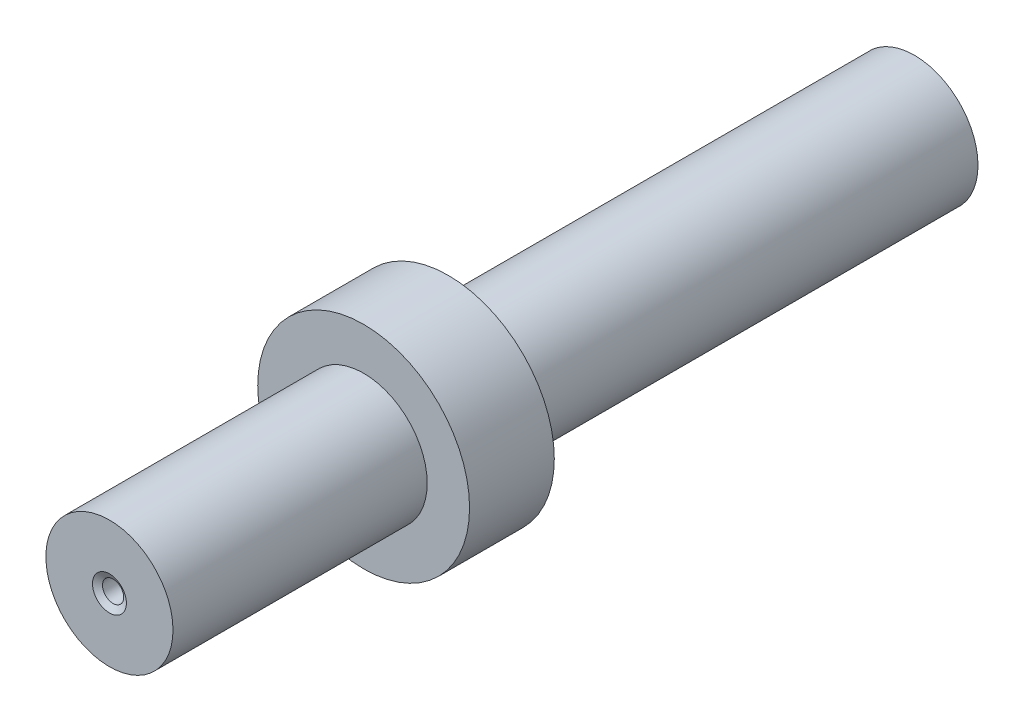
ISO-10303-21;
HEADER;
FILE_DESCRIPTION(('STEP AP214'),'2;1');
FILE_NAME('part.step','',(''),(''),'','','');
FILE_SCHEMA(('AUTOMOTIVE_DESIGN { 1 0 10303 214 1 1 1 1 }'));
ENDSEC;
DATA;
#1=APPLICATION_CONTEXT('core data for automotive mechanical design processes');
#2=APPLICATION_PROTOCOL_DEFINITION('international standard','automotive_design',2000,#1);
#3=PRODUCT_CONTEXT('',#1,'mechanical');
#4=PRODUCT('Part','Part','',(#3));
#5=PRODUCT_RELATED_PRODUCT_CATEGORY('part','',(#4));
#6=PRODUCT_DEFINITION_FORMATION('','',#4);
#7=PRODUCT_DEFINITION_CONTEXT('part definition',#1,'design');
#8=PRODUCT_DEFINITION('design','',#6,#7);
#9=PRODUCT_DEFINITION_SHAPE('','',#8);
#10=(LENGTH_UNIT() NAMED_UNIT(*) SI_UNIT(.MILLI.,.METRE.));
#11=(NAMED_UNIT(*) PLANE_ANGLE_UNIT() SI_UNIT($,.RADIAN.));
#12=(NAMED_UNIT(*) SI_UNIT($,.STERADIAN.) SOLID_ANGLE_UNIT());
#13=UNCERTAINTY_MEASURE_WITH_UNIT(LENGTH_MEASURE(1.E-05),#10,'distance_accuracy_value','');
#14=(GEOMETRIC_REPRESENTATION_CONTEXT(3) GLOBAL_UNCERTAINTY_ASSIGNED_CONTEXT((#13)) GLOBAL_UNIT_ASSIGNED_CONTEXT((#10,
#11,#12)) REPRESENTATION_CONTEXT('',''));
#15=CARTESIAN_POINT('',(0.,0.,0.));
#16=DIRECTION('',(0.,0.,1.));
#17=DIRECTION('',(1.,0.,0.));
#18=AXIS2_PLACEMENT_3D('',#15,#16,#17);
#19=CARTESIAN_POINT('',(0.,0.,10.));
#20=DIRECTION('',(0.,0.,-1.));
#21=DIRECTION('',(-1.,0.,0.));
#22=AXIS2_PLACEMENT_3D('',#19,#20,#21);
#23=CYLINDRICAL_SURFACE('',#22,12.5);
#24=CARTESIAN_POINT('',(0.,0.,10.));
#25=DIRECTION('',(0.,0.,1.));
#26=DIRECTION('',(1.,0.,0.));
#27=AXIS2_PLACEMENT_3D('',#24,#25,#26);
#28=CIRCLE('',#27,12.5);
#29=CARTESIAN_POINT('',(12.5,0.,10.));
#30=VERTEX_POINT('',#29);
#31=EDGE_CURVE('E54',#30,#30,#28,.T.);
#32=ORIENTED_EDGE('',*,*,#31,.F.);
#33=EDGE_LOOP('',(#32));
#34=FACE_BOUND('',#33,.T.);
#35=CARTESIAN_POINT('',(0.,0.,0.));
#36=DIRECTION('',(0.,0.,1.));
#37=DIRECTION('',(1.,0.,0.));
#38=AXIS2_PLACEMENT_3D('',#35,#36,#37);
#39=CIRCLE('',#38,12.5);
#40=CARTESIAN_POINT('',(12.5,0.,0.));
#41=VERTEX_POINT('',#40);
#42=EDGE_CURVE('E86',#41,#41,#39,.T.);
#43=ORIENTED_EDGE('',*,*,#42,.T.);
#44=EDGE_LOOP('',(#43));
#45=FACE_BOUND('',#44,.T.);
#46=ADVANCED_FACE('F47',(#34,#45),#23,.T.);
#47=CARTESIAN_POINT('',(0.,0.,10.));
#48=DIRECTION('',(0.,0.,1.));
#49=DIRECTION('',(1.,0.,0.));
#50=AXIS2_PLACEMENT_3D('',#47,#48,#49);
#51=PLANE('',#50);
#52=CARTESIAN_POINT('',(0.,0.,10.));
#53=DIRECTION('',(0.,0.,1.));
#54=DIRECTION('',(1.,0.,0.));
#55=AXIS2_PLACEMENT_3D('',#52,#53,#54);
#56=CIRCLE('',#55,7.5);
#57=CARTESIAN_POINT('',(7.5,0.,10.));
#58=VERTEX_POINT('',#57);
#59=EDGE_CURVE('E82',#58,#58,#56,.F.);
#60=ORIENTED_EDGE('',*,*,#59,.T.);
#61=EDGE_LOOP('',(#60));
#62=FACE_BOUND('',#61,.T.);
#63=ORIENTED_EDGE('',*,*,#31,.T.);
#64=EDGE_LOOP('',(#63));
#65=FACE_BOUND('',#64,.T.);
#66=ADVANCED_FACE('F98',(#62,#65),#51,.T.);
#67=CARTESIAN_POINT('',(0.,0.,0.));
#68=DIRECTION('',(0.,0.,1.));
#69=DIRECTION('',(1.,0.,0.));
#70=AXIS2_PLACEMENT_3D('',#67,#68,#69);
#71=PLANE('',#70);
#72=CARTESIAN_POINT('',(0.,0.,0.));
#73=DIRECTION('',(0.,0.,1.));
#74=DIRECTION('',(1.,0.,0.));
#75=AXIS2_PLACEMENT_3D('',#72,#73,#74);
#76=CIRCLE('',#75,7.5);
#77=CARTESIAN_POINT('',(7.5,0.,0.));
#78=VERTEX_POINT('',#77);
#79=EDGE_CURVE('E11',#78,#78,#76,.F.);
#80=ORIENTED_EDGE('',*,*,#79,.F.);
#81=EDGE_LOOP('',(#80));
#82=FACE_BOUND('',#81,.T.);
#83=ORIENTED_EDGE('',*,*,#42,.F.);
#84=EDGE_LOOP('',(#83));
#85=FACE_BOUND('',#84,.T.);
#86=ADVANCED_FACE('F95',(#82,#85),#71,.F.);
#87=CARTESIAN_POINT('',(0.,0.,40.));
#88=DIRECTION('',(0.,0.,-1.));
#89=DIRECTION('',(-1.,0.,0.));
#90=AXIS2_PLACEMENT_3D('',#87,#88,#89);
#91=CYLINDRICAL_SURFACE('',#90,7.5);
#92=ORIENTED_EDGE('',*,*,#59,.F.);
#93=EDGE_LOOP('',(#92));
#94=FACE_BOUND('',#93,.T.);
#95=CARTESIAN_POINT('',(0.,0.,40.));
#96=DIRECTION('',(0.,0.,1.));
#97=DIRECTION('',(1.,0.,0.));
#98=AXIS2_PLACEMENT_3D('',#95,#96,#97);
#99=CIRCLE('',#98,7.5);
#100=CARTESIAN_POINT('',(7.5,0.,40.));
#101=VERTEX_POINT('',#100);
#102=EDGE_CURVE('E72',#101,#101,#99,.T.);
#103=ORIENTED_EDGE('',*,*,#102,.F.);
#104=EDGE_LOOP('',(#103));
#105=FACE_BOUND('',#104,.T.);
#106=ADVANCED_FACE('F97',(#94,#105),#91,.T.);
#107=CARTESIAN_POINT('',(0.,0.,40.));
#108=DIRECTION('',(0.,0.,1.));
#109=DIRECTION('',(1.,0.,0.));
#110=AXIS2_PLACEMENT_3D('',#107,#108,#109);
#111=PLANE('',#110);
#112=CARTESIAN_POINT('',(0.,0.,40.));
#113=DIRECTION('',(0.,0.,1.));
#114=DIRECTION('',(1.,0.,0.));
#115=AXIS2_PLACEMENT_3D('',#112,#113,#114);
#116=CIRCLE('',#115,2.);
#117=CARTESIAN_POINT('',(2.,0.,40.));
#118=VERTEX_POINT('',#117);
#119=EDGE_CURVE('E75',#118,#118,#116,.T.);
#120=ORIENTED_EDGE('',*,*,#119,.F.);
#121=EDGE_LOOP('',(#120));
#122=FACE_BOUND('',#121,.T.);
#123=ORIENTED_EDGE('',*,*,#102,.T.);
#124=EDGE_LOOP('',(#123));
#125=FACE_BOUND('',#124,.T.);
#126=ADVANCED_FACE('F104',(#122,#125),#111,.T.);
#127=CARTESIAN_POINT('',(0.,0.,-55.));
#128=DIRECTION('',(0.,0.,1.));
#129=DIRECTION('',(1.,0.,0.));
#130=AXIS2_PLACEMENT_3D('',#127,#128,#129);
#131=CYLINDRICAL_SURFACE('',#130,7.5);
#132=CARTESIAN_POINT('',(0.,0.,-55.));
#133=DIRECTION('',(0.,0.,-1.));
#134=DIRECTION('',(-1.,0.,0.));
#135=AXIS2_PLACEMENT_3D('',#132,#133,#134);
#136=CIRCLE('',#135,7.5);
#137=CARTESIAN_POINT('',(-7.5,0.,-55.));
#138=VERTEX_POINT('',#137);
#139=EDGE_CURVE('E67',#138,#138,#136,.T.);
#140=ORIENTED_EDGE('',*,*,#139,.F.);
#141=EDGE_LOOP('',(#140));
#142=FACE_BOUND('',#141,.T.);
#143=ORIENTED_EDGE('',*,*,#79,.T.);
#144=EDGE_LOOP('',(#143));
#145=FACE_BOUND('',#144,.T.);
#146=ADVANCED_FACE('F140',(#142,#145),#131,.T.);
#147=CARTESIAN_POINT('',(0.,0.,-55.));
#148=DIRECTION('',(0.,0.,-1.));
#149=DIRECTION('',(-1.,0.,0.));
#150=AXIS2_PLACEMENT_3D('',#147,#148,#149);
#151=PLANE('',#150);
#152=ORIENTED_EDGE('',*,*,#139,.T.);
#153=EDGE_LOOP('',(#152));
#154=FACE_BOUND('',#153,.T.);
#155=ADVANCED_FACE('F61',(#154),#151,.T.);
#156=CARTESIAN_POINT('',(0.,0.,25.));
#157=DIRECTION('',(0.,0.,1.));
#158=DIRECTION('',(1.,0.,0.));
#159=AXIS2_PLACEMENT_3D('',#156,#157,#158);
#160=CONICAL_SURFACE('',#159,1.24999999999999,1.02974425867665);
#161=CARTESIAN_POINT('',(0.,0.,24.2489242262156));
#162=VERTEX_POINT('',#161);
#163=VERTEX_LOOP('',#162);
#164=FACE_BOUND('',#163,.T.);
#165=CARTESIAN_POINT('',(0.,0.,25.));
#166=DIRECTION('',(0.,0.,1.));
#167=DIRECTION('',(1.,0.,0.));
#168=AXIS2_PLACEMENT_3D('',#165,#166,#167);
#169=CIRCLE('',#168,1.24999999999999);
#170=CARTESIAN_POINT('',(1.24999999999999,0.,25.));
#171=VERTEX_POINT('',#170);
#172=EDGE_CURVE('E65',#171,#171,#169,.T.);
#173=ORIENTED_EDGE('',*,*,#172,.T.);
#174=EDGE_LOOP('',(#173));
#175=FACE_BOUND('',#174,.T.);
#176=ADVANCED_FACE('F57',(#164,#175),#160,.F.);
#177=CARTESIAN_POINT('',(0.,0.,40.));
#178=DIRECTION('',(0.,0.,1.));
#179=DIRECTION('',(1.,0.,0.));
#180=AXIS2_PLACEMENT_3D('',#177,#178,#179);
#181=CYLINDRICAL_SURFACE('',#180,1.24999999999999);
#182=ORIENTED_EDGE('',*,*,#172,.F.);
#183=EDGE_LOOP('',(#182));
#184=FACE_BOUND('',#183,.T.);
#185=CARTESIAN_POINT('',(0.,0.,39.5669872981078));
#186=DIRECTION('',(0.,0.,1.));
#187=DIRECTION('',(1.,0.,0.));
#188=AXIS2_PLACEMENT_3D('',#185,#186,#187);
#189=CIRCLE('',#188,1.25);
#190=CARTESIAN_POINT('',(1.25,0.,39.5669872981078));
#191=VERTEX_POINT('',#190);
#192=EDGE_CURVE('E68',#191,#191,#189,.T.);
#193=ORIENTED_EDGE('',*,*,#192,.T.);
#194=EDGE_LOOP('',(#193));
#195=FACE_BOUND('',#194,.T.);
#196=ADVANCED_FACE('F60',(#184,#195),#181,.F.);
#197=CARTESIAN_POINT('',(0.,0.,40.));
#198=DIRECTION('',(0.,0.,1.));
#199=DIRECTION('',(1.,0.,0.));
#200=AXIS2_PLACEMENT_3D('',#197,#198,#199);
#201=CONICAL_SURFACE('',#200,2.,1.0471975511966);
#202=ORIENTED_EDGE('',*,*,#192,.F.);
#203=EDGE_LOOP('',(#202));
#204=FACE_BOUND('',#203,.T.);
#205=ORIENTED_EDGE('',*,*,#119,.T.);
#206=EDGE_LOOP('',(#205));
#207=FACE_BOUND('',#206,.T.);
#208=ADVANCED_FACE('F174',(#204,#207),#201,.F.);
#209=CLOSED_SHELL('',(#46,#66,#86,#106,#126,#146,#155,#176,#196,#208));
#210=MANIFOLD_SOLID_BREP('B2',#209);
#211=ADVANCED_BREP_SHAPE_REPRESENTATION('',(#18,#210),#14);
#212=SHAPE_DEFINITION_REPRESENTATION(#9,#211);
ENDSEC;
END-ISO-10303-21;
